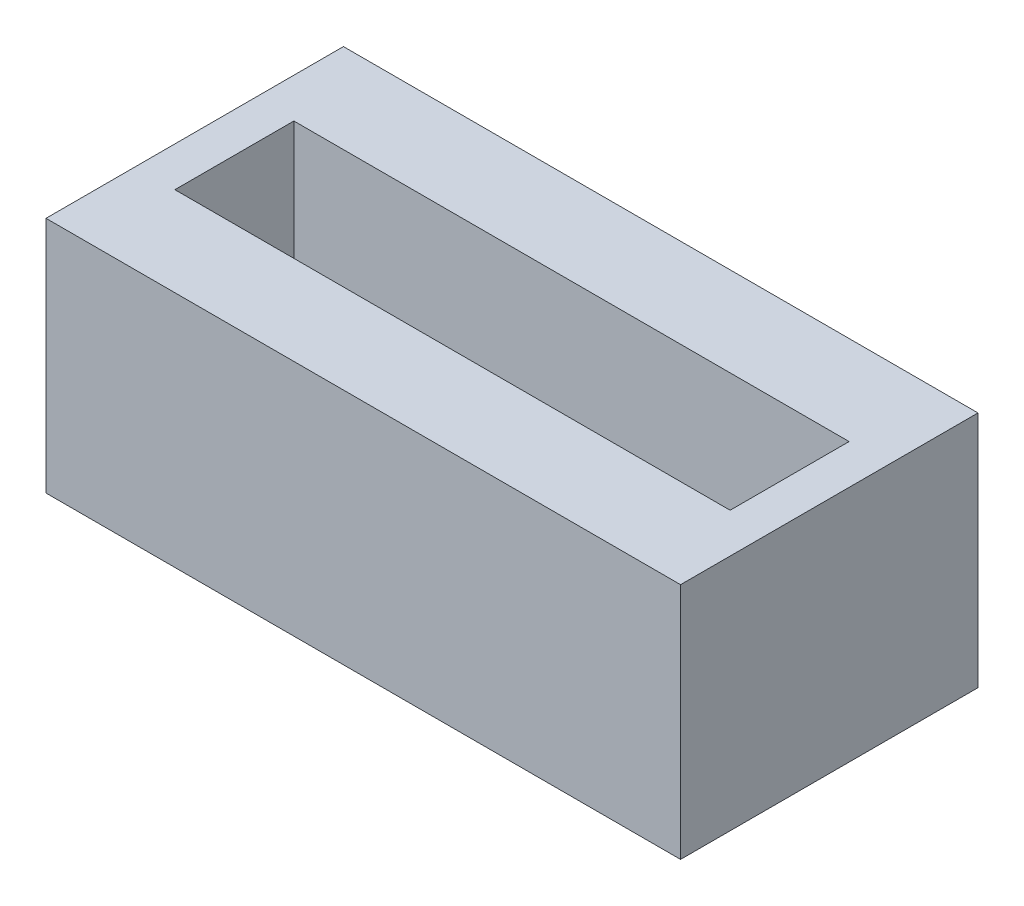
ISO-10303-21;
HEADER;
FILE_DESCRIPTION(('STEP AP214'),'2;1');
FILE_NAME('part.step','',(''),(''),'','','');
FILE_SCHEMA(('AUTOMOTIVE_DESIGN { 1 0 10303 214 1 1 1 1 }'));
ENDSEC;
DATA;
#1=APPLICATION_CONTEXT('core data for automotive mechanical design processes');
#2=APPLICATION_PROTOCOL_DEFINITION('international standard','automotive_design',2000,#1);
#3=PRODUCT_CONTEXT('',#1,'mechanical');
#4=PRODUCT('Part','Part','',(#3));
#5=PRODUCT_RELATED_PRODUCT_CATEGORY('part','',(#4));
#6=PRODUCT_DEFINITION_FORMATION('','',#4);
#7=PRODUCT_DEFINITION_CONTEXT('part definition',#1,'design');
#8=PRODUCT_DEFINITION('design','',#6,#7);
#9=PRODUCT_DEFINITION_SHAPE('','',#8);
#10=(LENGTH_UNIT() NAMED_UNIT(*) SI_UNIT(.MILLI.,.METRE.));
#11=(NAMED_UNIT(*) PLANE_ANGLE_UNIT() SI_UNIT($,.RADIAN.));
#12=(NAMED_UNIT(*) SI_UNIT($,.STERADIAN.) SOLID_ANGLE_UNIT());
#13=UNCERTAINTY_MEASURE_WITH_UNIT(LENGTH_MEASURE(1.E-05),#10,'distance_accuracy_value','');
#14=(GEOMETRIC_REPRESENTATION_CONTEXT(3) GLOBAL_UNCERTAINTY_ASSIGNED_CONTEXT((#13)) GLOBAL_UNIT_ASSIGNED_CONTEXT((#10,
#11,#12)) REPRESENTATION_CONTEXT('',''));
#15=CARTESIAN_POINT('',(0.,0.,0.));
#16=DIRECTION('',(0.,0.,1.));
#17=DIRECTION('',(1.,0.,0.));
#18=AXIS2_PLACEMENT_3D('',#15,#16,#17);
#19=CARTESIAN_POINT('',(-16.,12.,7.5));
#20=DIRECTION('',(-1.,0.,0.));
#21=DIRECTION('',(0.,0.,1.));
#22=AXIS2_PLACEMENT_3D('',#19,#20,#21);
#23=PLANE('',#22);
#24=DIRECTION('',(0.,0.,-1.));
#25=VECTOR('',#24,1.);
#26=CARTESIAN_POINT('',(-16.,0.,7.5));
#27=LINE('',#26,#25);
#28=CARTESIAN_POINT('',(-16.,0.,7.5));
#29=VERTEX_POINT('',#28);
#30=CARTESIAN_POINT('',(-16.,0.,-7.5));
#31=VERTEX_POINT('',#30);
#32=EDGE_CURVE('E150',#29,#31,#27,.T.);
#33=ORIENTED_EDGE('',*,*,#32,.F.);
#34=DIRECTION('',(0.,-1.,0.));
#35=VECTOR('',#34,1.);
#36=CARTESIAN_POINT('',(-16.,12.,7.5));
#37=LINE('',#36,#35);
#38=CARTESIAN_POINT('',(-16.,12.,7.5));
#39=VERTEX_POINT('',#38);
#40=EDGE_CURVE('E11',#39,#29,#37,.T.);
#41=ORIENTED_EDGE('',*,*,#40,.F.);
#42=DIRECTION('',(0.,0.,-1.));
#43=VECTOR('',#42,1.);
#44=CARTESIAN_POINT('',(-16.,12.,7.5));
#45=LINE('',#44,#43);
#46=CARTESIAN_POINT('',(-16.,12.,-7.5));
#47=VERTEX_POINT('',#46);
#48=EDGE_CURVE('E156',#39,#47,#45,.T.);
#49=ORIENTED_EDGE('',*,*,#48,.T.);
#50=DIRECTION('',(0.,-1.,0.));
#51=VECTOR('',#50,1.);
#52=CARTESIAN_POINT('',(-16.,12.,-7.5));
#53=LINE('',#52,#51);
#54=EDGE_CURVE('E46',#47,#31,#53,.T.);
#55=ORIENTED_EDGE('',*,*,#54,.T.);
#56=EDGE_LOOP('',(#33,#41,#49,#55));
#57=FACE_BOUND('',#56,.T.);
#58=ADVANCED_FACE('F43',(#57),#23,.T.);
#59=CARTESIAN_POINT('',(-16.,12.,7.5));
#60=DIRECTION('',(0.,0.,-1.));
#61=DIRECTION('',(-1.,0.,0.));
#62=AXIS2_PLACEMENT_3D('',#59,#60,#61);
#63=PLANE('',#62);
#64=DIRECTION('',(1.,0.,0.));
#65=VECTOR('',#64,1.);
#66=CARTESIAN_POINT('',(-16.,0.,7.5));
#67=LINE('',#66,#65);
#68=CARTESIAN_POINT('',(16.,0.,7.5));
#69=VERTEX_POINT('',#68);
#70=EDGE_CURVE('E161',#29,#69,#67,.T.);
#71=ORIENTED_EDGE('',*,*,#70,.T.);
#72=DIRECTION('',(0.,-1.,0.));
#73=VECTOR('',#72,1.);
#74=CARTESIAN_POINT('',(16.,12.,7.5));
#75=LINE('',#74,#73);
#76=CARTESIAN_POINT('',(16.,12.,7.5));
#77=VERTEX_POINT('',#76);
#78=EDGE_CURVE('E52',#77,#69,#75,.T.);
#79=ORIENTED_EDGE('',*,*,#78,.F.);
#80=DIRECTION('',(1.,0.,0.));
#81=VECTOR('',#80,1.);
#82=CARTESIAN_POINT('',(-16.,12.,7.5));
#83=LINE('',#82,#81);
#84=EDGE_CURVE('E168',#39,#77,#83,.T.);
#85=ORIENTED_EDGE('',*,*,#84,.F.);
#86=ORIENTED_EDGE('',*,*,#40,.T.);
#87=EDGE_LOOP('',(#71,#79,#85,#86));
#88=FACE_BOUND('',#87,.T.);
#89=ADVANCED_FACE('F203',(#88),#63,.F.);
#90=CARTESIAN_POINT('',(16.,12.,7.5));
#91=DIRECTION('',(-1.,0.,0.));
#92=DIRECTION('',(0.,0.,1.));
#93=AXIS2_PLACEMENT_3D('',#90,#91,#92);
#94=PLANE('',#93);
#95=DIRECTION('',(0.,0.,-1.));
#96=VECTOR('',#95,1.);
#97=CARTESIAN_POINT('',(16.,0.,7.5));
#98=LINE('',#97,#96);
#99=CARTESIAN_POINT('',(16.,0.,-7.5));
#100=VERTEX_POINT('',#99);
#101=EDGE_CURVE('E178',#69,#100,#98,.T.);
#102=ORIENTED_EDGE('',*,*,#101,.T.);
#103=DIRECTION('',(0.,-1.,0.));
#104=VECTOR('',#103,1.);
#105=CARTESIAN_POINT('',(16.,12.,-7.5));
#106=LINE('',#105,#104);
#107=CARTESIAN_POINT('',(16.,12.,-7.5));
#108=VERTEX_POINT('',#107);
#109=EDGE_CURVE('E186',#108,#100,#106,.T.);
#110=ORIENTED_EDGE('',*,*,#109,.F.);
#111=DIRECTION('',(0.,0.,-1.));
#112=VECTOR('',#111,1.);
#113=CARTESIAN_POINT('',(16.,12.,7.5));
#114=LINE('',#113,#112);
#115=EDGE_CURVE('E165',#77,#108,#114,.T.);
#116=ORIENTED_EDGE('',*,*,#115,.F.);
#117=ORIENTED_EDGE('',*,*,#78,.T.);
#118=EDGE_LOOP('',(#102,#110,#116,#117));
#119=FACE_BOUND('',#118,.T.);
#120=ADVANCED_FACE('F207',(#119),#94,.F.);
#121=CARTESIAN_POINT('',(-16.,12.,-7.5));
#122=DIRECTION('',(0.,0.,-1.));
#123=DIRECTION('',(-1.,0.,0.));
#124=AXIS2_PLACEMENT_3D('',#121,#122,#123);
#125=PLANE('',#124);
#126=DIRECTION('',(1.,0.,0.));
#127=VECTOR('',#126,1.);
#128=CARTESIAN_POINT('',(-16.,0.,-7.5));
#129=LINE('',#128,#127);
#130=EDGE_CURVE('E174',#31,#100,#129,.T.);
#131=ORIENTED_EDGE('',*,*,#130,.F.);
#132=ORIENTED_EDGE('',*,*,#54,.F.);
#133=DIRECTION('',(1.,0.,0.));
#134=VECTOR('',#133,1.);
#135=CARTESIAN_POINT('',(-16.,12.,-7.5));
#136=LINE('',#135,#134);
#137=EDGE_CURVE('E160',#47,#108,#136,.T.);
#138=ORIENTED_EDGE('',*,*,#137,.T.);
#139=ORIENTED_EDGE('',*,*,#109,.T.);
#140=EDGE_LOOP('',(#131,#132,#138,#139));
#141=FACE_BOUND('',#140,.T.);
#142=ADVANCED_FACE('F196',(#141),#125,.T.);
#143=CARTESIAN_POINT('',(0.,12.,0.));
#144=DIRECTION('',(0.,-1.,0.));
#145=DIRECTION('',(0.,0.,-1.));
#146=AXIS2_PLACEMENT_3D('',#143,#144,#145);
#147=PLANE('',#146);
#148=DIRECTION('',(1.,0.,0.));
#149=VECTOR('',#148,1.);
#150=CARTESIAN_POINT('',(-14.,12.,3.));
#151=LINE('',#150,#149);
#152=CARTESIAN_POINT('',(-14.,12.,3.));
#153=VERTEX_POINT('',#152);
#154=CARTESIAN_POINT('',(14.,12.,3.));
#155=VERTEX_POINT('',#154);
#156=EDGE_CURVE('E115',#153,#155,#151,.T.);
#157=ORIENTED_EDGE('',*,*,#156,.F.);
#158=DIRECTION('',(0.,0.,-1.));
#159=VECTOR('',#158,1.);
#160=CARTESIAN_POINT('',(-14.,12.,3.));
#161=LINE('',#160,#159);
#162=CARTESIAN_POINT('',(-14.,12.,-3.));
#163=VERTEX_POINT('',#162);
#164=EDGE_CURVE('E111',#153,#163,#161,.T.);
#165=ORIENTED_EDGE('',*,*,#164,.T.);
#166=DIRECTION('',(1.,0.,0.));
#167=VECTOR('',#166,1.);
#168=CARTESIAN_POINT('',(-14.,12.,-3.));
#169=LINE('',#168,#167);
#170=CARTESIAN_POINT('',(14.,12.,-3.));
#171=VERTEX_POINT('',#170);
#172=EDGE_CURVE('E118',#163,#171,#169,.T.);
#173=ORIENTED_EDGE('',*,*,#172,.T.);
#174=DIRECTION('',(0.,0.,-1.));
#175=VECTOR('',#174,1.);
#176=CARTESIAN_POINT('',(14.,12.,3.));
#177=LINE('',#176,#175);
#178=EDGE_CURVE('E123',#155,#171,#177,.T.);
#179=ORIENTED_EDGE('',*,*,#178,.F.);
#180=EDGE_LOOP('',(#157,#165,#173,#179));
#181=FACE_BOUND('',#180,.T.);
#182=ORIENTED_EDGE('',*,*,#48,.F.);
#183=ORIENTED_EDGE('',*,*,#84,.T.);
#184=ORIENTED_EDGE('',*,*,#115,.T.);
#185=ORIENTED_EDGE('',*,*,#137,.F.);
#186=EDGE_LOOP('',(#182,#183,#184,#185));
#187=FACE_BOUND('',#186,.T.);
#188=ADVANCED_FACE('F125',(#181,#187),#147,.F.);
#189=CARTESIAN_POINT('',(0.,0.,0.));
#190=DIRECTION('',(0.,-1.,0.));
#191=DIRECTION('',(0.,0.,-1.));
#192=AXIS2_PLACEMENT_3D('',#189,#190,#191);
#193=PLANE('',#192);
#194=DIRECTION('',(0.,0.,-1.));
#195=VECTOR('',#194,1.);
#196=CARTESIAN_POINT('',(-14.,0.,3.));
#197=LINE('',#196,#195);
#198=CARTESIAN_POINT('',(-14.,0.,3.));
#199=VERTEX_POINT('',#198);
#200=CARTESIAN_POINT('',(-14.,0.,-3.));
#201=VERTEX_POINT('',#200);
#202=EDGE_CURVE('E68',#199,#201,#197,.T.);
#203=ORIENTED_EDGE('',*,*,#202,.F.);
#204=DIRECTION('',(1.,0.,0.));
#205=VECTOR('',#204,1.);
#206=CARTESIAN_POINT('',(-14.,0.,3.));
#207=LINE('',#206,#205);
#208=CARTESIAN_POINT('',(14.,0.,3.));
#209=VERTEX_POINT('',#208);
#210=EDGE_CURVE('E128',#199,#209,#207,.T.);
#211=ORIENTED_EDGE('',*,*,#210,.T.);
#212=DIRECTION('',(0.,0.,-1.));
#213=VECTOR('',#212,1.);
#214=CARTESIAN_POINT('',(14.,0.,3.));
#215=LINE('',#214,#213);
#216=CARTESIAN_POINT('',(14.,0.,-3.));
#217=VERTEX_POINT('',#216);
#218=EDGE_CURVE('E132',#209,#217,#215,.T.);
#219=ORIENTED_EDGE('',*,*,#218,.T.);
#220=DIRECTION('',(1.,0.,0.));
#221=VECTOR('',#220,1.);
#222=CARTESIAN_POINT('',(-14.,0.,-3.));
#223=LINE('',#222,#221);
#224=EDGE_CURVE('E141',#201,#217,#223,.T.);
#225=ORIENTED_EDGE('',*,*,#224,.F.);
#226=EDGE_LOOP('',(#203,#211,#219,#225));
#227=FACE_BOUND('',#226,.T.);
#228=ORIENTED_EDGE('',*,*,#32,.T.);
#229=ORIENTED_EDGE('',*,*,#130,.T.);
#230=ORIENTED_EDGE('',*,*,#101,.F.);
#231=ORIENTED_EDGE('',*,*,#70,.F.);
#232=EDGE_LOOP('',(#228,#229,#230,#231));
#233=FACE_BOUND('',#232,.T.);
#234=ADVANCED_FACE('F200',(#227,#233),#193,.T.);
#235=CARTESIAN_POINT('',(-14.,12.,3.));
#236=DIRECTION('',(-1.,0.,0.));
#237=DIRECTION('',(0.,0.,1.));
#238=AXIS2_PLACEMENT_3D('',#235,#236,#237);
#239=PLANE('',#238);
#240=ORIENTED_EDGE('',*,*,#202,.T.);
#241=DIRECTION('',(0.,-1.,0.));
#242=VECTOR('',#241,1.);
#243=CARTESIAN_POINT('',(-14.,12.,-3.));
#244=LINE('',#243,#242);
#245=EDGE_CURVE('E108',#163,#201,#244,.T.);
#246=ORIENTED_EDGE('',*,*,#245,.F.);
#247=ORIENTED_EDGE('',*,*,#164,.F.);
#248=DIRECTION('',(0.,-1.,0.));
#249=VECTOR('',#248,1.);
#250=CARTESIAN_POINT('',(-14.,12.,3.));
#251=LINE('',#250,#249);
#252=EDGE_CURVE('E147',#153,#199,#251,.T.);
#253=ORIENTED_EDGE('',*,*,#252,.T.);
#254=EDGE_LOOP('',(#240,#246,#247,#253));
#255=FACE_BOUND('',#254,.T.);
#256=ADVANCED_FACE('F109',(#255),#239,.F.);
#257=CARTESIAN_POINT('',(-14.,12.,3.));
#258=DIRECTION('',(0.,0.,-1.));
#259=DIRECTION('',(-1.,0.,0.));
#260=AXIS2_PLACEMENT_3D('',#257,#258,#259);
#261=PLANE('',#260);
#262=ORIENTED_EDGE('',*,*,#210,.F.);
#263=ORIENTED_EDGE('',*,*,#252,.F.);
#264=ORIENTED_EDGE('',*,*,#156,.T.);
#265=DIRECTION('',(0.,-1.,0.));
#266=VECTOR('',#265,1.);
#267=CARTESIAN_POINT('',(14.,12.,3.));
#268=LINE('',#267,#266);
#269=EDGE_CURVE('E151',#155,#209,#268,.T.);
#270=ORIENTED_EDGE('',*,*,#269,.T.);
#271=EDGE_LOOP('',(#262,#263,#264,#270));
#272=FACE_BOUND('',#271,.T.);
#273=ADVANCED_FACE('F254',(#272),#261,.T.);
#274=CARTESIAN_POINT('',(14.,12.,3.));
#275=DIRECTION('',(-1.,0.,0.));
#276=DIRECTION('',(0.,0.,1.));
#277=AXIS2_PLACEMENT_3D('',#274,#275,#276);
#278=PLANE('',#277);
#279=ORIENTED_EDGE('',*,*,#218,.F.);
#280=ORIENTED_EDGE('',*,*,#269,.F.);
#281=ORIENTED_EDGE('',*,*,#178,.T.);
#282=DIRECTION('',(0.,-1.,0.));
#283=VECTOR('',#282,1.);
#284=CARTESIAN_POINT('',(14.,12.,-3.));
#285=LINE('',#284,#283);
#286=EDGE_CURVE('E60',#171,#217,#285,.T.);
#287=ORIENTED_EDGE('',*,*,#286,.T.);
#288=EDGE_LOOP('',(#279,#280,#281,#287));
#289=FACE_BOUND('',#288,.T.);
#290=ADVANCED_FACE('F263',(#289),#278,.T.);
#291=CARTESIAN_POINT('',(-14.,12.,-3.));
#292=DIRECTION('',(0.,0.,-1.));
#293=DIRECTION('',(-1.,0.,0.));
#294=AXIS2_PLACEMENT_3D('',#291,#292,#293);
#295=PLANE('',#294);
#296=ORIENTED_EDGE('',*,*,#224,.T.);
#297=ORIENTED_EDGE('',*,*,#286,.F.);
#298=ORIENTED_EDGE('',*,*,#172,.F.);
#299=ORIENTED_EDGE('',*,*,#245,.T.);
#300=EDGE_LOOP('',(#296,#297,#298,#299));
#301=FACE_BOUND('',#300,.T.);
#302=ADVANCED_FACE('F119',(#301),#295,.F.);
#303=CLOSED_SHELL('',(#58,#89,#120,#142,#188,#234,#256,#273,#290,#302));
#304=MANIFOLD_SOLID_BREP('B2',#303);
#305=ADVANCED_BREP_SHAPE_REPRESENTATION('',(#18,#304),#14);
#306=SHAPE_DEFINITION_REPRESENTATION(#9,#305);
ENDSEC;
END-ISO-10303-21;
